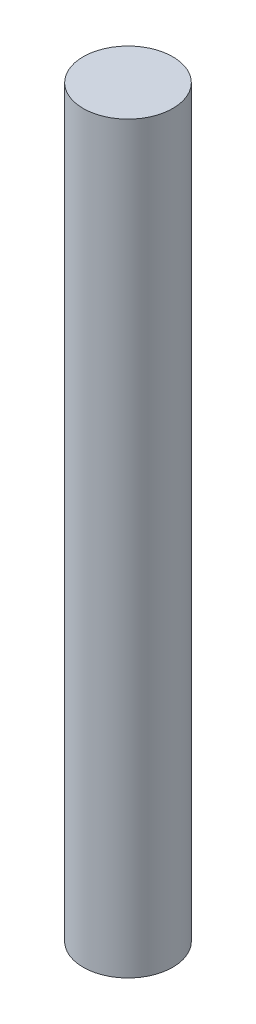
ISO-10303-21;
HEADER;
FILE_DESCRIPTION(('STEP AP214'),'2;1');
FILE_NAME('part.step','',(''),(''),'','','');
FILE_SCHEMA(('AUTOMOTIVE_DESIGN { 1 0 10303 214 1 1 1 1 }'));
ENDSEC;
DATA;
#1=APPLICATION_CONTEXT('core data for automotive mechanical design processes');
#2=APPLICATION_PROTOCOL_DEFINITION('international standard','automotive_design',2000,#1);
#3=PRODUCT_CONTEXT('',#1,'mechanical');
#4=PRODUCT('Part','Part','',(#3));
#5=PRODUCT_RELATED_PRODUCT_CATEGORY('part','',(#4));
#6=PRODUCT_DEFINITION_FORMATION('','',#4);
#7=PRODUCT_DEFINITION_CONTEXT('part definition',#1,'design');
#8=PRODUCT_DEFINITION('design','',#6,#7);
#9=PRODUCT_DEFINITION_SHAPE('','',#8);
#10=(LENGTH_UNIT() NAMED_UNIT(*) SI_UNIT(.MILLI.,.METRE.));
#11=(NAMED_UNIT(*) PLANE_ANGLE_UNIT() SI_UNIT($,.RADIAN.));
#12=(NAMED_UNIT(*) SI_UNIT($,.STERADIAN.) SOLID_ANGLE_UNIT());
#13=UNCERTAINTY_MEASURE_WITH_UNIT(LENGTH_MEASURE(1.E-05),#10,'distance_accuracy_value','');
#14=(GEOMETRIC_REPRESENTATION_CONTEXT(3) GLOBAL_UNCERTAINTY_ASSIGNED_CONTEXT((#13)) GLOBAL_UNIT_ASSIGNED_CONTEXT((#10,
#11,#12)) REPRESENTATION_CONTEXT('',''));
#15=CARTESIAN_POINT('',(0.,0.,0.));
#16=DIRECTION('',(0.,0.,1.));
#17=DIRECTION('',(1.,0.,0.));
#18=AXIS2_PLACEMENT_3D('',#15,#16,#17);
#19=CARTESIAN_POINT('',(0.,249.,0.));
#20=DIRECTION('',(0.,-1.,0.));
#21=DIRECTION('',(0.,0.,-1.));
#22=AXIS2_PLACEMENT_3D('',#19,#20,#21);
#23=CYLINDRICAL_SURFACE('',#22,15.);
#24=CARTESIAN_POINT('',(0.,249.,0.));
#25=DIRECTION('',(0.,1.,0.));
#26=DIRECTION('',(0.,0.,1.));
#27=AXIS2_PLACEMENT_3D('',#24,#25,#26);
#28=CIRCLE('',#27,15.);
#29=CARTESIAN_POINT('',(0.,249.,15.));
#30=VERTEX_POINT('',#29);
#31=EDGE_CURVE('E10',#30,#30,#28,.T.);
#32=ORIENTED_EDGE('',*,*,#31,.F.);
#33=EDGE_LOOP('',(#32));
#34=FACE_BOUND('',#33,.T.);
#35=CARTESIAN_POINT('',(0.,0.,0.));
#36=DIRECTION('',(0.,1.,0.));
#37=DIRECTION('',(0.,0.,1.));
#38=AXIS2_PLACEMENT_3D('',#35,#36,#37);
#39=CIRCLE('',#38,15.);
#40=CARTESIAN_POINT('',(0.,0.,15.));
#41=VERTEX_POINT('',#40);
#42=EDGE_CURVE('E40',#41,#41,#39,.T.);
#43=ORIENTED_EDGE('',*,*,#42,.T.);
#44=EDGE_LOOP('',(#43));
#45=FACE_BOUND('',#44,.T.);
#46=ADVANCED_FACE('F37',(#34,#45),#23,.T.);
#47=CARTESIAN_POINT('',(0.,249.,0.));
#48=DIRECTION('',(0.,1.,0.));
#49=DIRECTION('',(0.,0.,1.));
#50=AXIS2_PLACEMENT_3D('',#47,#48,#49);
#51=PLANE('',#50);
#52=ORIENTED_EDGE('',*,*,#31,.T.);
#53=EDGE_LOOP('',(#52));
#54=FACE_BOUND('',#53,.T.);
#55=ADVANCED_FACE('F52',(#54),#51,.T.);
#56=CARTESIAN_POINT('',(0.,0.,0.));
#57=DIRECTION('',(0.,1.,0.));
#58=DIRECTION('',(0.,0.,1.));
#59=AXIS2_PLACEMENT_3D('',#56,#57,#58);
#60=PLANE('',#59);
#61=ORIENTED_EDGE('',*,*,#42,.F.);
#62=EDGE_LOOP('',(#61));
#63=FACE_BOUND('',#62,.T.);
#64=ADVANCED_FACE('F50',(#63),#60,.F.);
#65=CLOSED_SHELL('',(#46,#55,#64));
#66=MANIFOLD_SOLID_BREP('B2',#65);
#67=ADVANCED_BREP_SHAPE_REPRESENTATION('',(#18,#66),#14);
#68=SHAPE_DEFINITION_REPRESENTATION(#9,#67);
ENDSEC;
END-ISO-10303-21;
